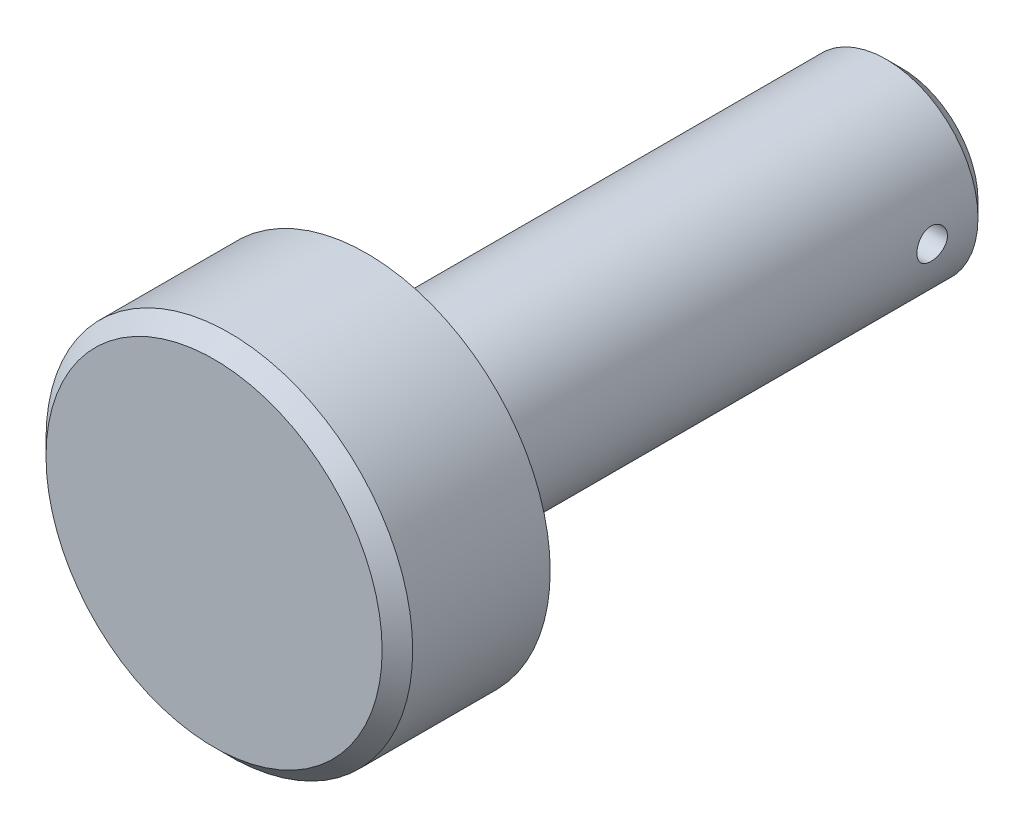
ISO-10303-21;
HEADER;
FILE_DESCRIPTION(('STEP AP214'),'2;1');
FILE_NAME('part.step','',(''),(''),'','','');
FILE_SCHEMA(('AUTOMOTIVE_DESIGN { 1 0 10303 214 1 1 1 1 }'));
ENDSEC;
DATA;
#1=APPLICATION_CONTEXT('core data for automotive mechanical design processes');
#2=APPLICATION_PROTOCOL_DEFINITION('international standard','automotive_design',2000,#1);
#3=PRODUCT_CONTEXT('',#1,'mechanical');
#4=PRODUCT('Part','Part','',(#3));
#5=PRODUCT_RELATED_PRODUCT_CATEGORY('part','',(#4));
#6=PRODUCT_DEFINITION_FORMATION('','',#4);
#7=PRODUCT_DEFINITION_CONTEXT('part definition',#1,'design');
#8=PRODUCT_DEFINITION('design','',#6,#7);
#9=PRODUCT_DEFINITION_SHAPE('','',#8);
#10=(LENGTH_UNIT() NAMED_UNIT(*) SI_UNIT(.MILLI.,.METRE.));
#11=(NAMED_UNIT(*) PLANE_ANGLE_UNIT() SI_UNIT($,.RADIAN.));
#12=(NAMED_UNIT(*) SI_UNIT($,.STERADIAN.) SOLID_ANGLE_UNIT());
#13=UNCERTAINTY_MEASURE_WITH_UNIT(LENGTH_MEASURE(1.E-05),#10,'distance_accuracy_value','');
#14=(GEOMETRIC_REPRESENTATION_CONTEXT(3) GLOBAL_UNCERTAINTY_ASSIGNED_CONTEXT((#13)) GLOBAL_UNIT_ASSIGNED_CONTEXT((#10,
#11,#12)) REPRESENTATION_CONTEXT('',''));
#15=CARTESIAN_POINT('',(0.,0.,0.));
#16=DIRECTION('',(0.,0.,1.));
#17=DIRECTION('',(1.,0.,0.));
#18=AXIS2_PLACEMENT_3D('',#15,#16,#17);
#19=CARTESIAN_POINT('',(0.,0.,0.));
#20=DIRECTION('',(0.,0.,-1.));
#21=DIRECTION('',(-1.,0.,0.));
#22=AXIS2_PLACEMENT_3D('',#19,#20,#21);
#23=PLANE('',#22);
#24=CARTESIAN_POINT('',(0.,0.,0.));
#25=DIRECTION('',(0.,0.,-1.));
#26=DIRECTION('',(-1.,0.,0.));
#27=AXIS2_PLACEMENT_3D('',#24,#25,#26);
#28=CIRCLE('',#27,11.);
#29=CARTESIAN_POINT('',(-11.,0.,0.));
#30=VERTEX_POINT('',#29);
#31=EDGE_CURVE('E40',#30,#30,#28,.F.);
#32=ORIENTED_EDGE('',*,*,#31,.T.);
#33=EDGE_LOOP('',(#32));
#34=FACE_BOUND('',#33,.T.);
#35=ADVANCED_FACE('F28',(#34),#23,.F.);
#36=CARTESIAN_POINT('',(0.,0.,0.));
#37=DIRECTION('',(0.,0.,1.));
#38=DIRECTION('',(1.,0.,0.));
#39=AXIS2_PLACEMENT_3D('',#36,#37,#38);
#40=CYLINDRICAL_SURFACE('',#39,12.);
#41=CARTESIAN_POINT('',(0.,0.,-0.999999999999989));
#42=DIRECTION('',(0.,0.,-1.));
#43=DIRECTION('',(-1.,0.,0.));
#44=AXIS2_PLACEMENT_3D('',#41,#42,#43);
#45=CIRCLE('',#44,12.);
#46=CARTESIAN_POINT('',(-12.,0.,-0.999999999999989));
#47=VERTEX_POINT('',#46);
#48=EDGE_CURVE('E10',#47,#47,#45,.T.);
#49=ORIENTED_EDGE('',*,*,#48,.T.);
#50=EDGE_LOOP('',(#49));
#51=FACE_BOUND('',#50,.T.);
#52=CARTESIAN_POINT('',(0.,0.,-10.));
#53=DIRECTION('',(0.,0.,1.));
#54=DIRECTION('',(1.,0.,0.));
#55=AXIS2_PLACEMENT_3D('',#52,#53,#54);
#56=CIRCLE('',#55,12.);
#57=CARTESIAN_POINT('',(12.,0.,-10.));
#58=VERTEX_POINT('',#57);
#59=EDGE_CURVE('E88',#58,#58,#56,.T.);
#60=ORIENTED_EDGE('',*,*,#59,.T.);
#61=EDGE_LOOP('',(#60));
#62=FACE_BOUND('',#61,.T.);
#63=ADVANCED_FACE('F74',(#51,#62),#40,.T.);
#64=CARTESIAN_POINT('',(0.,12.,-10.));
#65=DIRECTION('',(0.,0.,1.));
#66=DIRECTION('',(1.,0.,0.));
#67=AXIS2_PLACEMENT_3D('',#64,#65,#66);
#68=PLANE('',#67);
#69=ORIENTED_EDGE('',*,*,#59,.F.);
#70=EDGE_LOOP('',(#69));
#71=FACE_BOUND('',#70,.T.);
#72=CARTESIAN_POINT('',(0.,0.,-10.));
#73=DIRECTION('',(0.,0.,1.));
#74=DIRECTION('',(1.,0.,0.));
#75=AXIS2_PLACEMENT_3D('',#72,#73,#74);
#76=CIRCLE('',#75,6.);
#77=CARTESIAN_POINT('',(6.,0.,-10.));
#78=VERTEX_POINT('',#77);
#79=EDGE_CURVE('E91',#78,#78,#76,.T.);
#80=ORIENTED_EDGE('',*,*,#79,.T.);
#81=EDGE_LOOP('',(#80));
#82=FACE_BOUND('',#81,.T.);
#83=ADVANCED_FACE('F70',(#71,#82),#68,.F.);
#84=CARTESIAN_POINT('',(0.,0.,0.));
#85=DIRECTION('',(0.,0.,1.));
#86=DIRECTION('',(1.,0.,0.));
#87=AXIS2_PLACEMENT_3D('',#84,#85,#86);
#88=CYLINDRICAL_SURFACE('',#87,6.);
#89=CARTESIAN_POINT('',(6.,0.,-42.));
#90=CARTESIAN_POINT('',(5.99999904467529,-0.0557563619832858,-41.9999977644209));
#91=CARTESIAN_POINT('',(5.99921471165214,-0.111543152735528,-41.9953210900124));
#92=CARTESIAN_POINT('',(5.99616137976555,-0.221552088669216,-41.9767457364939));
#93=CARTESIAN_POINT('',(5.99389101569556,-0.275772747183698,-41.9628385772354));
#94=CARTESIAN_POINT('',(5.9881202729458,-0.381041898885056,-41.9262338205629));
#95=CARTESIAN_POINT('',(5.98462090063677,-0.432092947372759,-41.9035434137438));
#96=CARTESIAN_POINT('',(5.97677690832828,-0.529656736791176,-41.850035083179));
#97=CARTESIAN_POINT('',(5.97243238501774,-0.576169995951435,-41.8192180890068));
#98=CARTESIAN_POINT('',(5.96333326983325,-0.663789045716669,-41.7500179664718));
#99=CARTESIAN_POINT('',(5.95857548725943,-0.704845161413982,-41.7115723541455));
#100=CARTESIAN_POINT('',(5.94921050750693,-0.779955399463967,-41.6283408126109));
#101=CARTESIAN_POINT('',(5.94460331985067,-0.814009079756386,-41.5835544834174));
#102=CARTESIAN_POINT('',(5.93603026303912,-0.874346850242052,-41.4885716135212));
#103=CARTESIAN_POINT('',(5.93206851636654,-0.9005818211444,-41.4383434652781));
#104=CARTESIAN_POINT('',(5.9252791591787,-0.944223346164486,-41.3341161742797));
#105=CARTESIAN_POINT('',(5.92245147205723,-0.961630496626243,-41.2801172865289));
#106=CARTESIAN_POINT('',(5.91828214737102,-0.986965751113921,-41.1704078900574));
#107=CARTESIAN_POINT('',(5.9169270739428,-0.994979611654159,-41.1147177053994));
#108=CARTESIAN_POINT('',(5.9158157557466,-1.00156669011595,-41.0027678892466));
#109=CARTESIAN_POINT('',(5.91605939782886,-1.0001405761556,-40.9465082983331));
#110=CARTESIAN_POINT('',(5.91810571545422,-0.987958039358458,-40.8356288554898));
#111=CARTESIAN_POINT('',(5.91989229327567,-0.977297952755906,-40.7809980785819));
#112=CARTESIAN_POINT('',(5.92479798084403,-0.947101256161374,-40.6743114728683));
#113=CARTESIAN_POINT('',(5.92791713629309,-0.927564341727892,-40.6222557324446));
#114=CARTESIAN_POINT('',(5.9351539173364,-0.88007089843756,-40.5219084706236));
#115=CARTESIAN_POINT('',(5.9392762684293,-0.85207436555188,-40.4736362375675));
#116=CARTESIAN_POINT('',(5.94805167366003,-0.788484807022968,-40.3824382397846));
#117=CARTESIAN_POINT('',(5.95270477061714,-0.752891168261711,-40.339512907018));
#118=CARTESIAN_POINT('',(5.96208811151914,-0.674592884863619,-40.2596695656771));
#119=CARTESIAN_POINT('',(5.96681859692661,-0.631805585549249,-40.222832592584));
#120=CARTESIAN_POINT('',(5.97577040558689,-0.540614099592657,-40.1568488949339));
#121=CARTESIAN_POINT('',(5.97999172555898,-0.492209876762568,-40.1277022199267));
#122=CARTESIAN_POINT('',(5.98745557157165,-0.391082366466684,-40.0779191091455));
#123=CARTESIAN_POINT('',(5.99069727362979,-0.338355490225865,-40.0572898322675));
#124=CARTESIAN_POINT('',(5.99583001205064,-0.230119338241092,-40.0252023139016));
#125=CARTESIAN_POINT('',(5.9977211614019,-0.174610295671787,-40.0137433052105));
#126=CARTESIAN_POINT('',(5.99992451937074,-0.0630839605206487,-40.0004314566155));
#127=CARTESIAN_POINT('',(6.00025501205114,-0.007080294860404,-39.9984673712778));
#128=CARTESIAN_POINT('',(5.99934989768468,0.104455909155955,-40.0039045377712));
#129=CARTESIAN_POINT('',(5.99811435089647,0.159988465556815,-40.0113054292535));
#130=CARTESIAN_POINT('',(5.99422730775281,0.268662470218705,-40.0351699397342));
#131=CARTESIAN_POINT('',(5.99158441920524,0.321816347354152,-40.051578483356));
#132=CARTESIAN_POINT('',(5.98517785782144,0.424618753944177,-40.0929338072798));
#133=CARTESIAN_POINT('',(5.98141412204808,0.474267086363886,-40.1178810670541));
#134=CARTESIAN_POINT('',(5.97313806520963,0.569132275787581,-40.1758604498787));
#135=CARTESIAN_POINT('',(5.96861942354809,0.614306100374858,-40.2089620624669));
#136=CARTESIAN_POINT('',(5.9593538695676,0.698497434201074,-40.282214926154));
#137=CARTESIAN_POINT('',(5.95460694068619,0.73751449587863,-40.3223666893107));
#138=CARTESIAN_POINT('',(5.94536070094338,0.808697111863197,-40.4090790192286));
#139=CARTESIAN_POINT('',(5.94086446454842,0.840787504445483,-40.4557016662058));
#140=CARTESIAN_POINT('',(5.93268611911154,0.896680924117992,-40.5537411876554));
#141=CARTESIAN_POINT('',(5.92900398426408,0.920484213907926,-40.605157910091));
#142=CARTESIAN_POINT('',(5.92289381479082,0.959015332589257,-40.7111158931248));
#143=CARTESIAN_POINT('',(5.92046061724426,0.973780573019175,-40.7656432380122));
#144=CARTESIAN_POINT('',(5.91711086734104,0.993934181511309,-40.8764480516887));
#145=CARTESIAN_POINT('',(5.91619418313089,0.999323364778466,-40.9327253678928));
#146=CARTESIAN_POINT('',(5.91598693233605,1.00054914641894,-41.044682066385));
#147=CARTESIAN_POINT('',(5.9166762260226,0.996504054450072,-41.1003601514301));
#148=CARTESIAN_POINT('',(5.91955912581491,0.979231935582737,-41.2102316992203));
#149=CARTESIAN_POINT('',(5.92175272704486,0.966004938444988,-41.2644251667767));
#150=CARTESIAN_POINT('',(5.92738942512688,0.930789795837959,-41.369743374917));
#151=CARTESIAN_POINT('',(5.93083106887868,0.908811836240175,-41.4208716040224));
#152=CARTESIAN_POINT('',(5.93857747568883,0.856730801566362,-41.5187342676779));
#153=CARTESIAN_POINT('',(5.9428822815536,0.826627323499423,-41.5654684841488));
#154=CARTESIAN_POINT('',(5.95193381618249,0.758727553748857,-41.6538142332431));
#155=CARTESIAN_POINT('',(5.95668518230521,0.720844225437451,-41.6953584066801));
#156=CARTESIAN_POINT('',(5.96605748944336,0.638643612552084,-41.77154064179));
#157=CARTESIAN_POINT('',(5.97067840010619,0.59432484516505,-41.8061771074553));
#158=CARTESIAN_POINT('',(5.97930611856888,0.50014766785611,-41.86777930728));
#159=CARTESIAN_POINT('',(5.98330846501242,0.450253115013123,-41.8946904157252));
#160=CARTESIAN_POINT('',(5.9902046704071,0.346605227751587,-41.939707793844));
#161=CARTESIAN_POINT('',(5.99309963270993,0.292855797931999,-41.9578228324319));
#162=CARTESIAN_POINT('',(5.99682316333182,0.199081324018156,-41.9808021096507));
#163=CARTESIAN_POINT('',(5.99800810909344,0.159623532119375,-41.9879897878464));
#164=CARTESIAN_POINT('',(5.99959686394448,0.0801157241279205,-41.9975894951379));
#165=CARTESIAN_POINT('',(6.00000068648257,0.0400657182433961,-42.0000016064549));
#166=CARTESIAN_POINT('',(6.,0.,-42.));
#167=B_SPLINE_CURVE_WITH_KNOTS('',3,(#89,#90,#91,#92,#93,#94,#95,#96,#97,#98,#99,#100,#101,#102,
#103,#104,#105,#106,#107,#108,#109,#110,#111,#112,#113,#114,#115,#116,#117,#118,#119,#120,#121,
#122,#123,#124,#125,#126,#127,#128,#129,#130,#131,#132,#133,#134,#135,#136,#137,#138,#139,#140,
#141,#142,#143,#144,#145,#146,#147,#148,#149,#150,#151,#152,#153,#154,#155,#156,#157,#158,#159,
#160,#161,#162,#163,#164,#165,#166),.UNSPECIFIED.,.T.,.F.,(4,2,2,2,2,2,2,2,2,2,2,2,2,2,2,2,2,2,
2,2,2,2,2,2,2,2,2,2,2,2,2,2,2,2,2,2,2,2,4),(0.,0.167122633975403,0.334399018278168,
0.501538746810108,0.668659365069915,0.837209964249321,1.00577120067943,1.17537008329536,
1.34495750750472,1.51298430841369,1.68099921728354,1.84728208704164,2.01357066010153,
2.18065822653023,2.34775928272229,2.5169310796453,2.68610396654338,2.85541875566361,
3.02471937808459,3.19203153396558,3.35933725214343,3.52563122802565,3.69193454330426,
3.85970730250808,4.02749225221712,4.19701528803046,4.36653294950376,4.53534408936707,
4.70414055114646,4.87083163809079,5.03752218475252,5.20401927290488,5.37052462011734,
5.53900553677357,5.70752533551588,5.87720892642879,6.04672300852028,6.16681699265607,
6.28690890910786),.UNSPECIFIED.);
#168=CARTESIAN_POINT('',(6.,0.,-42.));
#169=VERTEX_POINT('',#168);
#170=EDGE_CURVE('E32',#169,#169,#167,.T.);
#171=ORIENTED_EDGE('',*,*,#170,.T.);
#172=EDGE_LOOP('',(#171));
#173=FACE_BOUND('',#172,.T.);
#174=CARTESIAN_POINT('',(-6.,0.,-42.));
#175=CARTESIAN_POINT('',(-5.99999904467529,0.0557563619832858,-41.9999977644209));
#176=CARTESIAN_POINT('',(-5.99921471165214,0.111543152735528,-41.9953210900124));
#177=CARTESIAN_POINT('',(-5.99616137976555,0.221552088669216,-41.9767457364939));
#178=CARTESIAN_POINT('',(-5.99389101569556,0.275772747183698,-41.9628385772354));
#179=CARTESIAN_POINT('',(-5.9881202729458,0.381041898885056,-41.9262338205629));
#180=CARTESIAN_POINT('',(-5.98462090063677,0.432092947372759,-41.9035434137438));
#181=CARTESIAN_POINT('',(-5.97677690832828,0.529656736791176,-41.850035083179));
#182=CARTESIAN_POINT('',(-5.97243238501774,0.576169995951435,-41.8192180890068));
#183=CARTESIAN_POINT('',(-5.96333326983325,0.663789045716669,-41.7500179664718));
#184=CARTESIAN_POINT('',(-5.95857548725943,0.704845161413982,-41.7115723541455));
#185=CARTESIAN_POINT('',(-5.94921050750693,0.779955399463967,-41.6283408126109));
#186=CARTESIAN_POINT('',(-5.94460331985067,0.814009079756386,-41.5835544834174));
#187=CARTESIAN_POINT('',(-5.93603026303912,0.874346850242052,-41.4885716135212));
#188=CARTESIAN_POINT('',(-5.93206851636654,0.9005818211444,-41.4383434652781));
#189=CARTESIAN_POINT('',(-5.9252791591787,0.944223346164486,-41.3341161742797));
#190=CARTESIAN_POINT('',(-5.92245147205723,0.961630496626243,-41.2801172865289));
#191=CARTESIAN_POINT('',(-5.91828214737102,0.986965751113921,-41.1704078900574));
#192=CARTESIAN_POINT('',(-5.9169270739428,0.994979611654159,-41.1147177053994));
#193=CARTESIAN_POINT('',(-5.9158157557466,1.00156669011595,-41.0027678892466));
#194=CARTESIAN_POINT('',(-5.91605939782886,1.0001405761556,-40.9465082983331));
#195=CARTESIAN_POINT('',(-5.91810571545422,0.987958039358458,-40.8356288554898));
#196=CARTESIAN_POINT('',(-5.91989229327567,0.977297952755906,-40.7809980785819));
#197=CARTESIAN_POINT('',(-5.92479798084403,0.947101256161374,-40.6743114728683));
#198=CARTESIAN_POINT('',(-5.92791713629309,0.927564341727892,-40.6222557324446));
#199=CARTESIAN_POINT('',(-5.9351539173364,0.88007089843756,-40.5219084706236));
#200=CARTESIAN_POINT('',(-5.9392762684293,0.85207436555188,-40.4736362375675));
#201=CARTESIAN_POINT('',(-5.94805167366003,0.788484807022968,-40.3824382397846));
#202=CARTESIAN_POINT('',(-5.95270477061714,0.752891168261711,-40.339512907018));
#203=CARTESIAN_POINT('',(-5.96208811151914,0.674592884863619,-40.2596695656771));
#204=CARTESIAN_POINT('',(-5.96681859692661,0.631805585549249,-40.222832592584));
#205=CARTESIAN_POINT('',(-5.97577040558689,0.540614099592657,-40.1568488949339));
#206=CARTESIAN_POINT('',(-5.97999172555898,0.492209876762568,-40.1277022199267));
#207=CARTESIAN_POINT('',(-5.98745557157165,0.391082366466684,-40.0779191091455));
#208=CARTESIAN_POINT('',(-5.99069727362979,0.338355490225865,-40.0572898322675));
#209=CARTESIAN_POINT('',(-5.99583001205064,0.230119338241092,-40.0252023139016));
#210=CARTESIAN_POINT('',(-5.9977211614019,0.174610295671787,-40.0137433052105));
#211=CARTESIAN_POINT('',(-5.99992451937074,0.0630839605206487,-40.0004314566155));
#212=CARTESIAN_POINT('',(-6.00025501205114,0.007080294860404,-39.9984673712778));
#213=CARTESIAN_POINT('',(-5.99934989768468,-0.104455909155955,-40.0039045377712));
#214=CARTESIAN_POINT('',(-5.99811435089647,-0.159988465556815,-40.0113054292535));
#215=CARTESIAN_POINT('',(-5.99422730775281,-0.268662470218705,-40.0351699397342));
#216=CARTESIAN_POINT('',(-5.99158441920524,-0.321816347354152,-40.051578483356));
#217=CARTESIAN_POINT('',(-5.98517785782144,-0.424618753944177,-40.0929338072798));
#218=CARTESIAN_POINT('',(-5.98141412204808,-0.474267086363886,-40.1178810670541));
#219=CARTESIAN_POINT('',(-5.97313806520963,-0.569132275787581,-40.1758604498787));
#220=CARTESIAN_POINT('',(-5.96861942354809,-0.614306100374858,-40.2089620624669));
#221=CARTESIAN_POINT('',(-5.9593538695676,-0.698497434201074,-40.282214926154));
#222=CARTESIAN_POINT('',(-5.95460694068619,-0.73751449587863,-40.3223666893107));
#223=CARTESIAN_POINT('',(-5.94536070094338,-0.808697111863197,-40.4090790192286));
#224=CARTESIAN_POINT('',(-5.94086446454842,-0.840787504445483,-40.4557016662058));
#225=CARTESIAN_POINT('',(-5.93268611911154,-0.896680924117992,-40.5537411876554));
#226=CARTESIAN_POINT('',(-5.92900398426408,-0.920484213907926,-40.605157910091));
#227=CARTESIAN_POINT('',(-5.92289381479082,-0.959015332589257,-40.7111158931248));
#228=CARTESIAN_POINT('',(-5.92046061724426,-0.973780573019175,-40.7656432380122));
#229=CARTESIAN_POINT('',(-5.91711086734104,-0.993934181511309,-40.8764480516887));
#230=CARTESIAN_POINT('',(-5.91619418313089,-0.999323364778466,-40.9327253678928));
#231=CARTESIAN_POINT('',(-5.91598693233605,-1.00054914641894,-41.044682066385));
#232=CARTESIAN_POINT('',(-5.9166762260226,-0.996504054450072,-41.1003601514301));
#233=CARTESIAN_POINT('',(-5.91955912581491,-0.979231935582737,-41.2102316992203));
#234=CARTESIAN_POINT('',(-5.92175272704486,-0.966004938444988,-41.2644251667767));
#235=CARTESIAN_POINT('',(-5.92738942512688,-0.930789795837959,-41.369743374917));
#236=CARTESIAN_POINT('',(-5.93083106887868,-0.908811836240175,-41.4208716040224));
#237=CARTESIAN_POINT('',(-5.93857747568883,-0.856730801566362,-41.5187342676779));
#238=CARTESIAN_POINT('',(-5.9428822815536,-0.826627323499423,-41.5654684841488));
#239=CARTESIAN_POINT('',(-5.95193381618249,-0.758727553748857,-41.6538142332431));
#240=CARTESIAN_POINT('',(-5.95668518230521,-0.720844225437451,-41.6953584066801));
#241=CARTESIAN_POINT('',(-5.96605748944336,-0.638643612552084,-41.77154064179));
#242=CARTESIAN_POINT('',(-5.97067840010619,-0.59432484516505,-41.8061771074553));
#243=CARTESIAN_POINT('',(-5.97930611856888,-0.50014766785611,-41.86777930728));
#244=CARTESIAN_POINT('',(-5.98330846501242,-0.450253115013123,-41.8946904157252));
#245=CARTESIAN_POINT('',(-5.9902046704071,-0.346605227751587,-41.939707793844));
#246=CARTESIAN_POINT('',(-5.99309963270993,-0.292855797931999,-41.9578228324319));
#247=CARTESIAN_POINT('',(-5.99682316333182,-0.199081324018156,-41.9808021096507));
#248=CARTESIAN_POINT('',(-5.99800810909344,-0.159623532119375,-41.9879897878464));
#249=CARTESIAN_POINT('',(-5.99959686394448,-0.0801157241279205,-41.9975894951379));
#250=CARTESIAN_POINT('',(-6.00000068648257,-0.0400657182433961,-42.0000016064549));
#251=CARTESIAN_POINT('',(-6.,0.,-42.));
#252=B_SPLINE_CURVE_WITH_KNOTS('',3,(#174,#175,#176,#177,#178,#179,#180,#181,#182,#183,#184,
#185,#186,#187,#188,#189,#190,#191,#192,#193,#194,#195,#196,#197,#198,#199,#200,#201,#202,#203,
#204,#205,#206,#207,#208,#209,#210,#211,#212,#213,#214,#215,#216,#217,#218,#219,#220,#221,#222,
#223,#224,#225,#226,#227,#228,#229,#230,#231,#232,#233,#234,#235,#236,#237,#238,#239,#240,#241,
#242,#243,#244,#245,#246,#247,#248,#249,#250,#251),.UNSPECIFIED.,.T.,.F.,(4,2,2,2,2,2,2,2,2,2,2,
2,2,2,2,2,2,2,2,2,2,2,2,2,2,2,2,2,2,2,2,2,2,2,2,2,2,2,4),(0.,0.167122633975403,
0.334399018278168,0.501538746810108,0.668659365069915,0.837209964249321,1.00577120067943,
1.17537008329536,1.34495750750472,1.51298430841369,1.68099921728354,1.84728208704164,
2.01357066010153,2.18065822653023,2.34775928272229,2.5169310796453,2.68610396654338,
2.85541875566361,3.02471937808459,3.19203153396558,3.35933725214343,3.52563122802565,
3.69193454330426,3.85970730250808,4.02749225221712,4.19701528803046,4.36653294950376,
4.53534408936707,4.70414055114646,4.87083163809079,5.03752218475252,5.20401927290488,
5.37052462011734,5.53900553677357,5.70752533551588,5.87720892642879,6.04672300852028,
6.16681699265607,6.28690890910786),.UNSPECIFIED.);
#253=CARTESIAN_POINT('',(-6.,0.,-42.));
#254=VERTEX_POINT('',#253);
#255=EDGE_CURVE('E48',#254,#254,#252,.T.);
#256=ORIENTED_EDGE('',*,*,#255,.T.);
#257=EDGE_LOOP('',(#256));
#258=FACE_BOUND('',#257,.T.);
#259=CARTESIAN_POINT('',(0.,0.,-44.));
#260=DIRECTION('',(0.,0.,1.));
#261=DIRECTION('',(1.,0.,0.));
#262=AXIS2_PLACEMENT_3D('',#259,#260,#261);
#263=CIRCLE('',#262,6.);
#264=CARTESIAN_POINT('',(6.,0.,-44.));
#265=VERTEX_POINT('',#264);
#266=EDGE_CURVE('E94',#265,#265,#263,.T.);
#267=ORIENTED_EDGE('',*,*,#266,.T.);
#268=EDGE_LOOP('',(#267));
#269=FACE_BOUND('',#268,.T.);
#270=ORIENTED_EDGE('',*,*,#79,.F.);
#271=EDGE_LOOP('',(#270));
#272=FACE_BOUND('',#271,.T.);
#273=ADVANCED_FACE('F52',(#173,#258,#269,#272),#88,.T.);
#274=CARTESIAN_POINT('',(0.,6.,-45.));
#275=DIRECTION('',(0.,0.,1.));
#276=DIRECTION('',(1.,0.,0.));
#277=AXIS2_PLACEMENT_3D('',#274,#275,#276);
#278=PLANE('',#277);
#279=CARTESIAN_POINT('',(0.,0.,-45.));
#280=DIRECTION('',(0.,0.,1.));
#281=DIRECTION('',(1.,0.,0.));
#282=AXIS2_PLACEMENT_3D('',#279,#280,#281);
#283=CIRCLE('',#282,5.);
#284=CARTESIAN_POINT('',(5.,0.,-45.));
#285=VERTEX_POINT('',#284);
#286=EDGE_CURVE('E45',#285,#285,#283,.F.);
#287=ORIENTED_EDGE('',*,*,#286,.T.);
#288=EDGE_LOOP('',(#287));
#289=FACE_BOUND('',#288,.T.);
#290=ADVANCED_FACE('F60',(#289),#278,.F.);
#291=CARTESIAN_POINT('',(0.,0.,-44.));
#292=DIRECTION('',(0.,0.,1.));
#293=DIRECTION('',(1.,0.,0.));
#294=AXIS2_PLACEMENT_3D('',#291,#292,#293);
#295=CONICAL_SURFACE('',#294,6.,0.785398163397457);
#296=ORIENTED_EDGE('',*,*,#286,.F.);
#297=EDGE_LOOP('',(#296));
#298=FACE_BOUND('',#297,.T.);
#299=ORIENTED_EDGE('',*,*,#266,.F.);
#300=EDGE_LOOP('',(#299));
#301=FACE_BOUND('',#300,.T.);
#302=ADVANCED_FACE('F63',(#298,#301),#295,.T.);
#303=CARTESIAN_POINT('',(0.,0.,0.));
#304=DIRECTION('',(0.,0.,-1.));
#305=DIRECTION('',(-1.,0.,0.));
#306=AXIS2_PLACEMENT_3D('',#303,#304,#305);
#307=CONICAL_SURFACE('',#306,11.,0.78539816339745);
#308=ORIENTED_EDGE('',*,*,#48,.F.);
#309=EDGE_LOOP('',(#308));
#310=FACE_BOUND('',#309,.T.);
#311=ORIENTED_EDGE('',*,*,#31,.F.);
#312=EDGE_LOOP('',(#311));
#313=FACE_BOUND('',#312,.T.);
#314=ADVANCED_FACE('F30',(#310,#313),#307,.T.);
#315=CARTESIAN_POINT('',(-12.,0.,-41.));
#316=DIRECTION('',(1.,0.,0.));
#317=DIRECTION('',(0.,0.,-1.));
#318=AXIS2_PLACEMENT_3D('',#315,#316,#317);
#319=CYLINDRICAL_SURFACE('',#318,0.999999999999998);
#320=ORIENTED_EDGE('',*,*,#255,.F.);
#321=EDGE_LOOP('',(#320));
#322=FACE_BOUND('',#321,.T.);
#323=ORIENTED_EDGE('',*,*,#170,.F.);
#324=EDGE_LOOP('',(#323));
#325=FACE_BOUND('',#324,.T.);
#326=ADVANCED_FACE('F56',(#322,#325),#319,.F.);
#327=CLOSED_SHELL('',(#35,#63,#83,#273,#290,#302,#314,#326));
#328=MANIFOLD_SOLID_BREP('B2',#327);
#329=ADVANCED_BREP_SHAPE_REPRESENTATION('',(#18,#328),#14);
#330=SHAPE_DEFINITION_REPRESENTATION(#9,#329);
ENDSEC;
END-ISO-10303-21;
